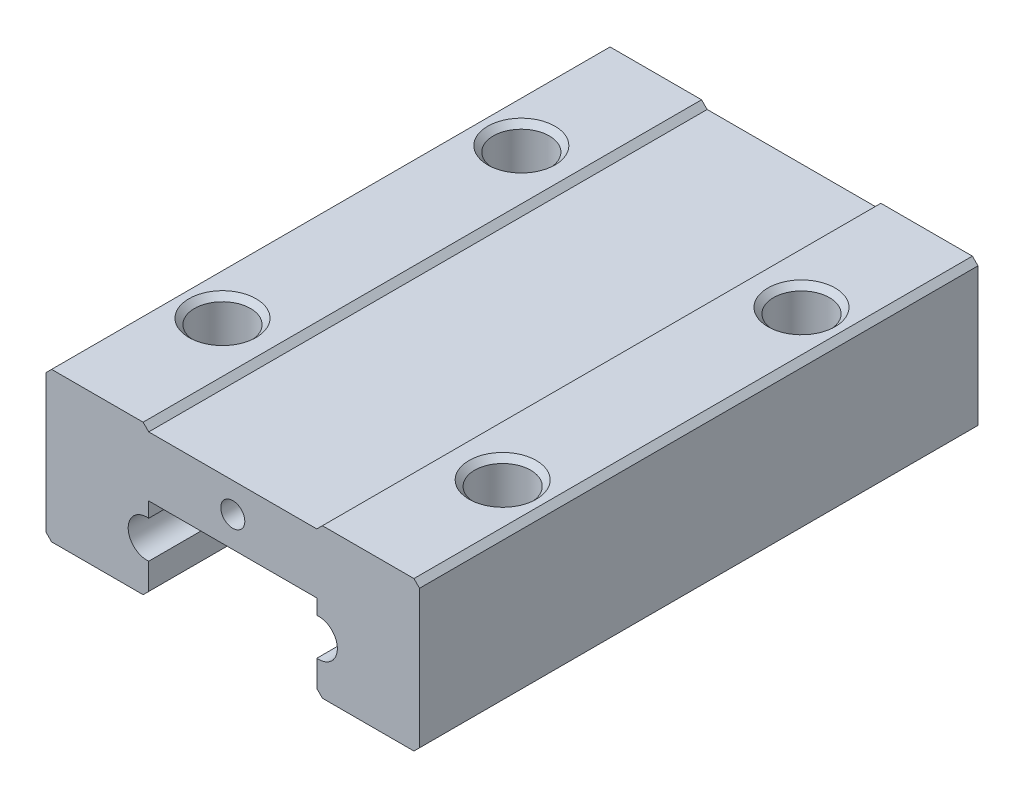
ISO-10303-21;
HEADER;
FILE_DESCRIPTION(('STEP AP214'),'2;1');
FILE_NAME('part.step','',(''),(''),'','','');
FILE_SCHEMA(('AUTOMOTIVE_DESIGN { 1 0 10303 214 1 1 1 1 }'));
ENDSEC;
DATA;
#1=APPLICATION_CONTEXT('core data for automotive mechanical design processes');
#2=APPLICATION_PROTOCOL_DEFINITION('international standard','automotive_design',2000,#1);
#3=PRODUCT_CONTEXT('',#1,'mechanical');
#4=PRODUCT('Part','Part','',(#3));
#5=PRODUCT_RELATED_PRODUCT_CATEGORY('part','',(#4));
#6=PRODUCT_DEFINITION_FORMATION('','',#4);
#7=PRODUCT_DEFINITION_CONTEXT('part definition',#1,'design');
#8=PRODUCT_DEFINITION('design','',#6,#7);
#9=PRODUCT_DEFINITION_SHAPE('','',#8);
#10=(LENGTH_UNIT() NAMED_UNIT(*) SI_UNIT(.MILLI.,.METRE.));
#11=(NAMED_UNIT(*) PLANE_ANGLE_UNIT() SI_UNIT($,.RADIAN.));
#12=(NAMED_UNIT(*) SI_UNIT($,.STERADIAN.) SOLID_ANGLE_UNIT());
#13=UNCERTAINTY_MEASURE_WITH_UNIT(LENGTH_MEASURE(1.E-05),#10,'distance_accuracy_value','');
#14=(GEOMETRIC_REPRESENTATION_CONTEXT(3) GLOBAL_UNCERTAINTY_ASSIGNED_CONTEXT((#13)) GLOBAL_UNIT_ASSIGNED_CONTEXT((#10,
#11,#12)) REPRESENTATION_CONTEXT('',''));
#15=CARTESIAN_POINT('',(0.,0.,0.));
#16=DIRECTION('',(0.,0.,1.));
#17=DIRECTION('',(1.,0.,0.));
#18=AXIS2_PLACEMENT_3D('',#15,#16,#17);
#19=CARTESIAN_POINT('',(0.,0.,-14.95));
#20=DIRECTION('',(0.,0.,-1.));
#21=DIRECTION('',(0.,-1.,0.));
#22=AXIS2_PLACEMENT_3D('',#19,#20,#21);
#23=PLANE('',#22);
#24=CARTESIAN_POINT('',(0.,2.12300290726788,-14.95));
#25=DIRECTION('',(0.,0.,1.));
#26=DIRECTION('',(1.,0.,0.));
#27=AXIS2_PLACEMENT_3D('',#24,#25,#26);
#28=CIRCLE('',#27,0.644009461630724);
#29=CARTESIAN_POINT('',(0.644009461630724,2.12300290726788,-14.95));
#30=VERTEX_POINT('',#29);
#31=EDGE_CURVE('E458',#30,#30,#28,.T.);
#32=ORIENTED_EDGE('',*,*,#31,.T.);
#33=EDGE_LOOP('',(#32));
#34=FACE_BOUND('',#33,.T.);
#35=DIRECTION('',(1.,0.,0.));
#36=VECTOR('',#35,1.);
#37=CARTESIAN_POINT('',(4.8,4.,-14.95));
#38=LINE('',#37,#36);
#39=CARTESIAN_POINT('',(4.8,4.,-14.95));
#40=VERTEX_POINT('',#39);
#41=CARTESIAN_POINT('',(9.7,4.,-14.95));
#42=VERTEX_POINT('',#41);
#43=EDGE_CURVE('E179',#40,#42,#38,.T.);
#44=ORIENTED_EDGE('',*,*,#43,.T.);
#45=DIRECTION('',(-0.707106781186546,0.707106781186549,0.));
#46=VECTOR('',#45,1.);
#47=CARTESIAN_POINT('',(10.,3.7,-14.95));
#48=LINE('',#47,#46);
#49=CARTESIAN_POINT('',(10.,3.7,-14.95));
#50=VERTEX_POINT('',#49);
#51=EDGE_CURVE('E472',#50,#42,#48,.T.);
#52=ORIENTED_EDGE('',*,*,#51,.F.);
#53=DIRECTION('',(0.,1.,0.));
#54=VECTOR('',#53,1.);
#55=CARTESIAN_POINT('',(10.,-3.7,-14.95));
#56=LINE('',#55,#54);
#57=CARTESIAN_POINT('',(10.,-3.7,-14.95));
#58=VERTEX_POINT('',#57);
#59=EDGE_CURVE('E384',#58,#50,#56,.T.);
#60=ORIENTED_EDGE('',*,*,#59,.F.);
#61=DIRECTION('',(0.707106781186546,0.707106781186549,0.));
#62=VECTOR('',#61,1.);
#63=CARTESIAN_POINT('',(9.7,-4.,-14.95));
#64=LINE('',#63,#62);
#65=CARTESIAN_POINT('',(9.7,-4.,-14.95));
#66=VERTEX_POINT('',#65);
#67=EDGE_CURVE('E515',#66,#58,#64,.T.);
#68=ORIENTED_EDGE('',*,*,#67,.F.);
#69=DIRECTION('',(1.,0.,0.));
#70=VECTOR('',#69,1.);
#71=CARTESIAN_POINT('',(4.8,-4.,-14.95));
#72=LINE('',#71,#70);
#73=CARTESIAN_POINT('',(4.8,-4.,-14.95));
#74=VERTEX_POINT('',#73);
#75=EDGE_CURVE('E361',#74,#66,#72,.T.);
#76=ORIENTED_EDGE('',*,*,#75,.F.);
#77=DIRECTION('',(0.707106781186547,-0.707106781186548,0.));
#78=VECTOR('',#77,1.);
#79=CARTESIAN_POINT('',(4.5,-3.7,-14.95));
#80=LINE('',#79,#78);
#81=CARTESIAN_POINT('',(4.5,-3.7,-14.95));
#82=VERTEX_POINT('',#81);
#83=EDGE_CURVE('E330',#82,#74,#80,.T.);
#84=ORIENTED_EDGE('',*,*,#83,.F.);
#85=DIRECTION('',(0.,1.,0.));
#86=VECTOR('',#85,1.);
#87=CARTESIAN_POINT('',(4.5,-3.7,-14.95));
#88=LINE('',#87,#86);
#89=CARTESIAN_POINT('',(4.5,-2.29498743710662,-14.95));
#90=VERTEX_POINT('',#89);
#91=EDGE_CURVE('E321',#82,#90,#88,.T.);
#92=ORIENTED_EDGE('',*,*,#91,.T.);
#93=CARTESIAN_POINT('',(4.6,-1.3,-14.95));
#94=DIRECTION('',(0.,0.,-1.));
#95=DIRECTION('',(1.,0.,0.));
#96=AXIS2_PLACEMENT_3D('',#93,#94,#95);
#97=CIRCLE('',#96,1.);
#98=CARTESIAN_POINT('',(4.5,-0.305012562893379,-14.95));
#99=VERTEX_POINT('',#98);
#100=EDGE_CURVE('E566',#99,#90,#97,.T.);
#101=ORIENTED_EDGE('',*,*,#100,.F.);
#102=DIRECTION('',(0.,1.,0.));
#103=VECTOR('',#102,1.);
#104=CARTESIAN_POINT('',(4.5,-0.305012562893379,-14.95));
#105=LINE('',#104,#103);
#106=CARTESIAN_POINT('',(4.5,0.5,-14.95));
#107=VERTEX_POINT('',#106);
#108=EDGE_CURVE('E28',#99,#107,#105,.T.);
#109=ORIENTED_EDGE('',*,*,#108,.T.);
#110=DIRECTION('',(1.,0.,0.));
#111=VECTOR('',#110,1.);
#112=CARTESIAN_POINT('',(-4.5,0.5,-14.95));
#113=LINE('',#112,#111);
#114=CARTESIAN_POINT('',(-4.5,0.5,-14.95));
#115=VERTEX_POINT('',#114);
#116=EDGE_CURVE('E354',#115,#107,#113,.T.);
#117=ORIENTED_EDGE('',*,*,#116,.F.);
#118=DIRECTION('',(0.,1.,0.));
#119=VECTOR('',#118,1.);
#120=CARTESIAN_POINT('',(-4.5,-0.30501256289338,-14.95));
#121=LINE('',#120,#119);
#122=CARTESIAN_POINT('',(-4.5,-0.30501256289338,-14.95));
#123=VERTEX_POINT('',#122);
#124=EDGE_CURVE('E448',#123,#115,#121,.T.);
#125=ORIENTED_EDGE('',*,*,#124,.F.);
#126=CARTESIAN_POINT('',(-4.6,-1.3,-14.95));
#127=DIRECTION('',(0.,0.,1.));
#128=DIRECTION('',(1.,0.,0.));
#129=AXIS2_PLACEMENT_3D('',#126,#127,#128);
#130=CIRCLE('',#129,1.);
#131=CARTESIAN_POINT('',(-4.5,-2.29498743710662,-14.95));
#132=VERTEX_POINT('',#131);
#133=EDGE_CURVE('E538',#123,#132,#130,.T.);
#134=ORIENTED_EDGE('',*,*,#133,.T.);
#135=DIRECTION('',(0.,1.,0.));
#136=VECTOR('',#135,1.);
#137=CARTESIAN_POINT('',(-4.5,-3.7,-14.95));
#138=LINE('',#137,#136);
#139=CARTESIAN_POINT('',(-4.5,-3.7,-14.95));
#140=VERTEX_POINT('',#139);
#141=EDGE_CURVE('E358',#140,#132,#138,.T.);
#142=ORIENTED_EDGE('',*,*,#141,.F.);
#143=DIRECTION('',(0.707106781186547,0.707106781186548,0.));
#144=VECTOR('',#143,1.);
#145=CARTESIAN_POINT('',(-4.8,-4.,-14.95));
#146=LINE('',#145,#144);
#147=CARTESIAN_POINT('',(-4.8,-4.,-14.95));
#148=VERTEX_POINT('',#147);
#149=EDGE_CURVE('E344',#148,#140,#146,.T.);
#150=ORIENTED_EDGE('',*,*,#149,.F.);
#151=DIRECTION('',(1.,0.,0.));
#152=VECTOR('',#151,1.);
#153=CARTESIAN_POINT('',(-9.7,-4.,-14.95));
#154=LINE('',#153,#152);
#155=CARTESIAN_POINT('',(-9.7,-4.,-14.95));
#156=VERTEX_POINT('',#155);
#157=EDGE_CURVE('E355',#156,#148,#154,.T.);
#158=ORIENTED_EDGE('',*,*,#157,.F.);
#159=DIRECTION('',(0.707106781186543,-0.707106781186552,0.));
#160=VECTOR('',#159,1.);
#161=CARTESIAN_POINT('',(-10.,-3.7,-14.95));
#162=LINE('',#161,#160);
#163=CARTESIAN_POINT('',(-10.,-3.7,-14.95));
#164=VERTEX_POINT('',#163);
#165=EDGE_CURVE('E402',#164,#156,#162,.T.);
#166=ORIENTED_EDGE('',*,*,#165,.F.);
#167=DIRECTION('',(0.,1.,0.));
#168=VECTOR('',#167,1.);
#169=CARTESIAN_POINT('',(-10.,-3.7,-14.95));
#170=LINE('',#169,#168);
#171=CARTESIAN_POINT('',(-10.,3.7,-14.95));
#172=VERTEX_POINT('',#171);
#173=EDGE_CURVE('E235',#164,#172,#170,.T.);
#174=ORIENTED_EDGE('',*,*,#173,.T.);
#175=DIRECTION('',(-0.707106781186544,-0.707106781186551,0.));
#176=VECTOR('',#175,1.);
#177=CARTESIAN_POINT('',(-9.7,4.,-14.95));
#178=LINE('',#177,#176);
#179=CARTESIAN_POINT('',(-9.7,4.,-14.95));
#180=VERTEX_POINT('',#179);
#181=EDGE_CURVE('E546',#180,#172,#178,.T.);
#182=ORIENTED_EDGE('',*,*,#181,.F.);
#183=DIRECTION('',(1.,0.,0.));
#184=VECTOR('',#183,1.);
#185=CARTESIAN_POINT('',(-9.7,4.,-14.95));
#186=LINE('',#185,#184);
#187=CARTESIAN_POINT('',(-4.8,4.,-14.95));
#188=VERTEX_POINT('',#187);
#189=EDGE_CURVE('E444',#180,#188,#186,.T.);
#190=ORIENTED_EDGE('',*,*,#189,.T.);
#191=DIRECTION('',(-0.707106781186547,0.707106781186548,0.));
#192=VECTOR('',#191,1.);
#193=CARTESIAN_POINT('',(-4.5,3.7,-14.95));
#194=LINE('',#193,#192);
#195=CARTESIAN_POINT('',(-4.5,3.7,-14.95));
#196=VERTEX_POINT('',#195);
#197=EDGE_CURVE('E377',#196,#188,#194,.T.);
#198=ORIENTED_EDGE('',*,*,#197,.F.);
#199=DIRECTION('',(1.,0.,0.));
#200=VECTOR('',#199,1.);
#201=CARTESIAN_POINT('',(-4.5,3.7,-14.95));
#202=LINE('',#201,#200);
#203=CARTESIAN_POINT('',(4.5,3.7,-14.95));
#204=VERTEX_POINT('',#203);
#205=EDGE_CURVE('E189',#196,#204,#202,.T.);
#206=ORIENTED_EDGE('',*,*,#205,.T.);
#207=DIRECTION('',(-0.707106781186547,-0.707106781186548,0.));
#208=VECTOR('',#207,1.);
#209=CARTESIAN_POINT('',(4.8,4.,-14.95));
#210=LINE('',#209,#208);
#211=EDGE_CURVE('E420',#40,#204,#210,.T.);
#212=ORIENTED_EDGE('',*,*,#211,.F.);
#213=EDGE_LOOP('',(#44,#52,#60,#68,#76,#84,#92,#101,#109,#117,#125,#134,#142,#150,#158,#166,
#174,#182,#190,#198,#206,#212));
#214=FACE_BOUND('',#213,.T.);
#215=ADVANCED_FACE('F17',(#34,#214),#23,.T.);
#216=CARTESIAN_POINT('',(-7.5,1.,-8.));
#217=DIRECTION('',(0.,1.,0.));
#218=DIRECTION('',(1.,0.,0.));
#219=AXIS2_PLACEMENT_3D('',#216,#217,#218);
#220=PLANE('',#219);
#221=CARTESIAN_POINT('',(-7.5,1.,-8.));
#222=DIRECTION('',(0.,-1.,0.));
#223=DIRECTION('',(0.,0.,-1.));
#224=AXIS2_PLACEMENT_3D('',#221,#222,#223);
#225=CIRCLE('',#224,1.5);
#226=CARTESIAN_POINT('',(-7.5,1.,-6.5));
#227=VERTEX_POINT('',#226);
#228=EDGE_CURVE('E480',#227,#227,#225,.T.);
#229=ORIENTED_EDGE('',*,*,#228,.F.);
#230=EDGE_LOOP('',(#229));
#231=FACE_BOUND('',#230,.T.);
#232=ADVANCED_FACE('F986',(#231),#220,.T.);
#233=CARTESIAN_POINT('',(7.5,1.,-8.));
#234=DIRECTION('',(0.,-1.,0.));
#235=DIRECTION('',(0.,0.,-1.));
#236=AXIS2_PLACEMENT_3D('',#233,#234,#235);
#237=PLANE('',#236);
#238=CARTESIAN_POINT('',(7.5,1.,-8.));
#239=DIRECTION('',(0.,-1.,0.));
#240=DIRECTION('',(0.,0.,1.));
#241=AXIS2_PLACEMENT_3D('',#238,#239,#240);
#242=CIRCLE('',#241,1.5);
#243=CARTESIAN_POINT('',(7.5,1.,-6.5));
#244=VERTEX_POINT('',#243);
#245=EDGE_CURVE('E525',#244,#244,#242,.T.);
#246=ORIENTED_EDGE('',*,*,#245,.F.);
#247=EDGE_LOOP('',(#246));
#248=FACE_BOUND('',#247,.T.);
#249=ADVANCED_FACE('F1026',(#248),#237,.F.);
#250=CARTESIAN_POINT('',(0.,0.,14.95));
#251=DIRECTION('',(0.,0.,1.));
#252=DIRECTION('',(1.,0.,0.));
#253=AXIS2_PLACEMENT_3D('',#250,#251,#252);
#254=PLANE('',#253);
#255=CARTESIAN_POINT('',(0.,2.12300290726788,14.95));
#256=DIRECTION('',(0.,0.,1.));
#257=DIRECTION('',(1.,0.,0.));
#258=AXIS2_PLACEMENT_3D('',#255,#256,#257);
#259=CIRCLE('',#258,0.644009461630724);
#260=CARTESIAN_POINT('',(0.644009461630724,2.12300290726788,14.95));
#261=VERTEX_POINT('',#260);
#262=EDGE_CURVE('E362',#261,#261,#259,.T.);
#263=ORIENTED_EDGE('',*,*,#262,.F.);
#264=EDGE_LOOP('',(#263));
#265=FACE_BOUND('',#264,.T.);
#266=DIRECTION('',(1.,0.,0.));
#267=VECTOR('',#266,1.);
#268=CARTESIAN_POINT('',(4.8,4.,14.95));
#269=LINE('',#268,#267);
#270=CARTESIAN_POINT('',(4.8,4.,14.95));
#271=VERTEX_POINT('',#270);
#272=CARTESIAN_POINT('',(9.7,4.,14.95));
#273=VERTEX_POINT('',#272);
#274=EDGE_CURVE('E59',#271,#273,#269,.T.);
#275=ORIENTED_EDGE('',*,*,#274,.F.);
#276=DIRECTION('',(-0.707106781186547,-0.707106781186548,0.));
#277=VECTOR('',#276,1.);
#278=CARTESIAN_POINT('',(4.8,4.,14.95));
#279=LINE('',#278,#277);
#280=CARTESIAN_POINT('',(4.5,3.7,14.95));
#281=VERTEX_POINT('',#280);
#282=EDGE_CURVE('E412',#271,#281,#279,.T.);
#283=ORIENTED_EDGE('',*,*,#282,.T.);
#284=DIRECTION('',(1.,0.,0.));
#285=VECTOR('',#284,1.);
#286=CARTESIAN_POINT('',(-4.5,3.7,14.95));
#287=LINE('',#286,#285);
#288=CARTESIAN_POINT('',(-4.5,3.7,14.95));
#289=VERTEX_POINT('',#288);
#290=EDGE_CURVE('E510',#289,#281,#287,.T.);
#291=ORIENTED_EDGE('',*,*,#290,.F.);
#292=DIRECTION('',(-0.707106781186547,0.707106781186548,0.));
#293=VECTOR('',#292,1.);
#294=CARTESIAN_POINT('',(-4.5,3.7,14.95));
#295=LINE('',#294,#293);
#296=CARTESIAN_POINT('',(-4.8,4.,14.95));
#297=VERTEX_POINT('',#296);
#298=EDGE_CURVE('E378',#289,#297,#295,.T.);
#299=ORIENTED_EDGE('',*,*,#298,.T.);
#300=DIRECTION('',(1.,0.,0.));
#301=VECTOR('',#300,1.);
#302=CARTESIAN_POINT('',(-9.7,4.,14.95));
#303=LINE('',#302,#301);
#304=CARTESIAN_POINT('',(-9.7,4.,14.95));
#305=VERTEX_POINT('',#304);
#306=EDGE_CURVE('E440',#305,#297,#303,.T.);
#307=ORIENTED_EDGE('',*,*,#306,.F.);
#308=DIRECTION('',(-0.707106781186544,-0.707106781186551,0.));
#309=VECTOR('',#308,1.);
#310=CARTESIAN_POINT('',(-9.7,4.,14.95));
#311=LINE('',#310,#309);
#312=CARTESIAN_POINT('',(-10.,3.7,14.95));
#313=VERTEX_POINT('',#312);
#314=EDGE_CURVE('E519',#305,#313,#311,.T.);
#315=ORIENTED_EDGE('',*,*,#314,.T.);
#316=DIRECTION('',(0.,1.,0.));
#317=VECTOR('',#316,1.);
#318=CARTESIAN_POINT('',(-10.,-3.7,14.95));
#319=LINE('',#318,#317);
#320=CARTESIAN_POINT('',(-10.,-3.7,14.95));
#321=VERTEX_POINT('',#320);
#322=EDGE_CURVE('E260',#321,#313,#319,.T.);
#323=ORIENTED_EDGE('',*,*,#322,.F.);
#324=DIRECTION('',(0.707106781186543,-0.707106781186552,0.));
#325=VECTOR('',#324,1.);
#326=CARTESIAN_POINT('',(-10.,-3.7,14.95));
#327=LINE('',#326,#325);
#328=CARTESIAN_POINT('',(-9.7,-4.,14.95));
#329=VERTEX_POINT('',#328);
#330=EDGE_CURVE('E403',#321,#329,#327,.T.);
#331=ORIENTED_EDGE('',*,*,#330,.T.);
#332=DIRECTION('',(1.,0.,0.));
#333=VECTOR('',#332,1.);
#334=CARTESIAN_POINT('',(-9.7,-4.,14.95));
#335=LINE('',#334,#333);
#336=CARTESIAN_POINT('',(-4.8,-4.,14.95));
#337=VERTEX_POINT('',#336);
#338=EDGE_CURVE('E248',#329,#337,#335,.T.);
#339=ORIENTED_EDGE('',*,*,#338,.T.);
#340=DIRECTION('',(0.707106781186547,0.707106781186548,0.));
#341=VECTOR('',#340,1.);
#342=CARTESIAN_POINT('',(-4.8,-4.,14.95));
#343=LINE('',#342,#341);
#344=CARTESIAN_POINT('',(-4.5,-3.7,14.95));
#345=VERTEX_POINT('',#344);
#346=EDGE_CURVE('E545',#337,#345,#343,.T.);
#347=ORIENTED_EDGE('',*,*,#346,.T.);
#348=DIRECTION('',(0.,1.,0.));
#349=VECTOR('',#348,1.);
#350=CARTESIAN_POINT('',(-4.5,-3.7,14.95));
#351=LINE('',#350,#349);
#352=CARTESIAN_POINT('',(-4.5,-2.29498743710662,14.95));
#353=VERTEX_POINT('',#352);
#354=EDGE_CURVE('E436',#345,#353,#351,.T.);
#355=ORIENTED_EDGE('',*,*,#354,.T.);
#356=CARTESIAN_POINT('',(-4.6,-1.3,14.95));
#357=DIRECTION('',(0.,0.,1.));
#358=DIRECTION('',(1.,0.,0.));
#359=AXIS2_PLACEMENT_3D('',#356,#357,#358);
#360=CIRCLE('',#359,1.);
#361=CARTESIAN_POINT('',(-4.5,-0.30501256289338,14.95));
#362=VERTEX_POINT('',#361);
#363=EDGE_CURVE('E454',#362,#353,#360,.T.);
#364=ORIENTED_EDGE('',*,*,#363,.F.);
#365=DIRECTION('',(0.,1.,0.));
#366=VECTOR('',#365,1.);
#367=CARTESIAN_POINT('',(-4.5,-0.30501256289338,14.95));
#368=LINE('',#367,#366);
#369=CARTESIAN_POINT('',(-4.5,0.5,14.95));
#370=VERTEX_POINT('',#369);
#371=EDGE_CURVE('E439',#362,#370,#368,.T.);
#372=ORIENTED_EDGE('',*,*,#371,.T.);
#373=DIRECTION('',(1.,0.,0.));
#374=VECTOR('',#373,1.);
#375=CARTESIAN_POINT('',(-4.5,0.5,14.95));
#376=LINE('',#375,#374);
#377=CARTESIAN_POINT('',(4.5,0.5,14.95));
#378=VERTEX_POINT('',#377);
#379=EDGE_CURVE('E445',#370,#378,#376,.T.);
#380=ORIENTED_EDGE('',*,*,#379,.T.);
#381=DIRECTION('',(0.,1.,0.));
#382=VECTOR('',#381,1.);
#383=CARTESIAN_POINT('',(4.5,-0.305012562893379,14.95));
#384=LINE('',#383,#382);
#385=CARTESIAN_POINT('',(4.5,-0.305012562893379,14.95));
#386=VERTEX_POINT('',#385);
#387=EDGE_CURVE('E11',#386,#378,#384,.T.);
#388=ORIENTED_EDGE('',*,*,#387,.F.);
#389=CARTESIAN_POINT('',(4.6,-1.3,14.95));
#390=DIRECTION('',(0.,0.,-1.));
#391=DIRECTION('',(1.,0.,0.));
#392=AXIS2_PLACEMENT_3D('',#389,#390,#391);
#393=CIRCLE('',#392,1.);
#394=CARTESIAN_POINT('',(4.5,-2.29498743710662,14.95));
#395=VERTEX_POINT('',#394);
#396=EDGE_CURVE('E316',#386,#395,#393,.T.);
#397=ORIENTED_EDGE('',*,*,#396,.T.);
#398=DIRECTION('',(0.,1.,0.));
#399=VECTOR('',#398,1.);
#400=CARTESIAN_POINT('',(4.5,-3.7,14.95));
#401=LINE('',#400,#399);
#402=CARTESIAN_POINT('',(4.5,-3.7,14.95));
#403=VERTEX_POINT('',#402);
#404=EDGE_CURVE('E311',#403,#395,#401,.T.);
#405=ORIENTED_EDGE('',*,*,#404,.F.);
#406=DIRECTION('',(0.707106781186547,-0.707106781186548,0.));
#407=VECTOR('',#406,1.);
#408=CARTESIAN_POINT('',(4.5,-3.7,14.95));
#409=LINE('',#408,#407);
#410=CARTESIAN_POINT('',(4.8,-4.,14.95));
#411=VERTEX_POINT('',#410);
#412=EDGE_CURVE('E314',#403,#411,#409,.T.);
#413=ORIENTED_EDGE('',*,*,#412,.T.);
#414=DIRECTION('',(1.,0.,0.));
#415=VECTOR('',#414,1.);
#416=CARTESIAN_POINT('',(4.8,-4.,14.95));
#417=LINE('',#416,#415);
#418=CARTESIAN_POINT('',(9.7,-4.,14.95));
#419=VERTEX_POINT('',#418);
#420=EDGE_CURVE('E498',#411,#419,#417,.T.);
#421=ORIENTED_EDGE('',*,*,#420,.T.);
#422=DIRECTION('',(0.707106781186546,0.707106781186549,0.));
#423=VECTOR('',#422,1.);
#424=CARTESIAN_POINT('',(9.7,-4.,14.95));
#425=LINE('',#424,#423);
#426=CARTESIAN_POINT('',(10.,-3.7,14.95));
#427=VERTEX_POINT('',#426);
#428=EDGE_CURVE('E394',#419,#427,#425,.T.);
#429=ORIENTED_EDGE('',*,*,#428,.T.);
#430=DIRECTION('',(0.,1.,0.));
#431=VECTOR('',#430,1.);
#432=CARTESIAN_POINT('',(10.,-3.7,14.95));
#433=LINE('',#432,#431);
#434=CARTESIAN_POINT('',(10.,3.7,14.95));
#435=VERTEX_POINT('',#434);
#436=EDGE_CURVE('E76',#427,#435,#433,.T.);
#437=ORIENTED_EDGE('',*,*,#436,.T.);
#438=DIRECTION('',(-0.707106781186546,0.707106781186549,0.));
#439=VECTOR('',#438,1.);
#440=CARTESIAN_POINT('',(10.,3.7,14.95));
#441=LINE('',#440,#439);
#442=EDGE_CURVE('E428',#435,#273,#441,.T.);
#443=ORIENTED_EDGE('',*,*,#442,.T.);
#444=EDGE_LOOP('',(#275,#283,#291,#299,#307,#315,#323,#331,#339,#347,#355,#364,#372,#380,#388,
#397,#405,#413,#421,#429,#437,#443));
#445=FACE_BOUND('',#444,.T.);
#446=ADVANCED_FACE('F19',(#265,#445),#254,.T.);
#447=CARTESIAN_POINT('',(4.5,0.,14.95));
#448=DIRECTION('',(-1.,0.,0.));
#449=DIRECTION('',(0.,1.,0.));
#450=AXIS2_PLACEMENT_3D('',#447,#448,#449);
#451=PLANE('',#450);
#452=DIRECTION('',(0.,0.,-1.));
#453=VECTOR('',#452,1.);
#454=CARTESIAN_POINT('',(4.5,0.5,14.95));
#455=LINE('',#454,#453);
#456=EDGE_CURVE('E449',#378,#107,#455,.T.);
#457=ORIENTED_EDGE('',*,*,#456,.T.);
#458=ORIENTED_EDGE('',*,*,#108,.F.);
#459=DIRECTION('',(0.,0.,-1.));
#460=VECTOR('',#459,1.);
#461=CARTESIAN_POINT('',(4.5,-0.305012562893379,14.95));
#462=LINE('',#461,#460);
#463=EDGE_CURVE('E501',#386,#99,#462,.T.);
#464=ORIENTED_EDGE('',*,*,#463,.F.);
#465=ORIENTED_EDGE('',*,*,#387,.T.);
#466=EDGE_LOOP('',(#457,#458,#464,#465));
#467=FACE_BOUND('',#466,.T.);
#468=ADVANCED_FACE('F598',(#467),#451,.T.);
#469=CARTESIAN_POINT('',(4.5,0.,14.95));
#470=DIRECTION('',(-1.,0.,0.));
#471=DIRECTION('',(0.,0.,1.));
#472=AXIS2_PLACEMENT_3D('',#469,#470,#471);
#473=PLANE('',#472);
#474=DIRECTION('',(0.,0.,-1.));
#475=VECTOR('',#474,1.);
#476=CARTESIAN_POINT('',(4.5,-2.29498743710662,14.95));
#477=LINE('',#476,#475);
#478=EDGE_CURVE('E533',#395,#90,#477,.T.);
#479=ORIENTED_EDGE('',*,*,#478,.T.);
#480=ORIENTED_EDGE('',*,*,#91,.F.);
#481=DIRECTION('',(0.,0.,1.));
#482=VECTOR('',#481,1.);
#483=CARTESIAN_POINT('',(4.5,-3.7,-14.95));
#484=LINE('',#483,#482);
#485=EDGE_CURVE('E324',#82,#403,#484,.T.);
#486=ORIENTED_EDGE('',*,*,#485,.T.);
#487=ORIENTED_EDGE('',*,*,#404,.T.);
#488=EDGE_LOOP('',(#479,#480,#486,#487));
#489=FACE_BOUND('',#488,.T.);
#490=ADVANCED_FACE('F325',(#489),#473,.T.);
#491=CARTESIAN_POINT('',(0.,-4.,14.95));
#492=DIRECTION('',(0.,1.,0.));
#493=DIRECTION('',(1.,0.,0.));
#494=AXIS2_PLACEMENT_3D('',#491,#492,#493);
#495=PLANE('',#494);
#496=ORIENTED_EDGE('',*,*,#420,.F.);
#497=DIRECTION('',(0.,0.,-1.));
#498=VECTOR('',#497,1.);
#499=CARTESIAN_POINT('',(4.8,-4.,14.95));
#500=LINE('',#499,#498);
#501=EDGE_CURVE('E335',#411,#74,#500,.T.);
#502=ORIENTED_EDGE('',*,*,#501,.T.);
#503=ORIENTED_EDGE('',*,*,#75,.T.);
#504=DIRECTION('',(0.,0.,1.));
#505=VECTOR('',#504,1.);
#506=CARTESIAN_POINT('',(9.7,-4.,-14.95));
#507=LINE('',#506,#505);
#508=EDGE_CURVE('E397',#66,#419,#507,.T.);
#509=ORIENTED_EDGE('',*,*,#508,.T.);
#510=EDGE_LOOP('',(#496,#502,#503,#509));
#511=FACE_BOUND('',#510,.T.);
#512=ADVANCED_FACE('F949',(#511),#495,.F.);
#513=CARTESIAN_POINT('',(10.,0.,14.95));
#514=DIRECTION('',(-1.,0.,0.));
#515=DIRECTION('',(0.,0.,1.));
#516=AXIS2_PLACEMENT_3D('',#513,#514,#515);
#517=PLANE('',#516);
#518=ORIENTED_EDGE('',*,*,#436,.F.);
#519=DIRECTION('',(0.,0.,-1.));
#520=VECTOR('',#519,1.);
#521=CARTESIAN_POINT('',(10.,-3.7,14.95));
#522=LINE('',#521,#520);
#523=EDGE_CURVE('E511',#427,#58,#522,.T.);
#524=ORIENTED_EDGE('',*,*,#523,.T.);
#525=ORIENTED_EDGE('',*,*,#59,.T.);
#526=DIRECTION('',(0.,0.,1.));
#527=VECTOR('',#526,1.);
#528=CARTESIAN_POINT('',(10.,3.7,-14.95));
#529=LINE('',#528,#527);
#530=EDGE_CURVE('E348',#50,#435,#529,.T.);
#531=ORIENTED_EDGE('',*,*,#530,.T.);
#532=EDGE_LOOP('',(#518,#524,#525,#531));
#533=FACE_BOUND('',#532,.T.);
#534=ADVANCED_FACE('F679',(#533),#517,.F.);
#535=CARTESIAN_POINT('',(0.,4.,14.95));
#536=DIRECTION('',(0.,1.,0.));
#537=DIRECTION('',(0.,0.,-1.));
#538=AXIS2_PLACEMENT_3D('',#535,#536,#537);
#539=PLANE('',#538);
#540=CARTESIAN_POINT('',(7.5,4.,8.));
#541=DIRECTION('',(0.,-1.,0.));
#542=DIRECTION('',(-1.,0.,0.));
#543=AXIS2_PLACEMENT_3D('',#540,#541,#542);
#544=CIRCLE('',#543,1.8);
#545=CARTESIAN_POINT('',(7.5,4.,6.2));
#546=VERTEX_POINT('',#545);
#547=EDGE_CURVE('E371',#546,#546,#544,.T.);
#548=ORIENTED_EDGE('',*,*,#547,.T.);
#549=EDGE_LOOP('',(#548));
#550=FACE_BOUND('',#549,.T.);
#551=CARTESIAN_POINT('',(7.5,4.,-8.));
#552=DIRECTION('',(0.,1.,0.));
#553=DIRECTION('',(-1.,0.,0.));
#554=AXIS2_PLACEMENT_3D('',#551,#552,#553);
#555=CIRCLE('',#554,1.8);
#556=CARTESIAN_POINT('',(7.5,4.,-6.2));
#557=VERTEX_POINT('',#556);
#558=EDGE_CURVE('E478',#557,#557,#555,.T.);
#559=ORIENTED_EDGE('',*,*,#558,.F.);
#560=EDGE_LOOP('',(#559));
#561=FACE_BOUND('',#560,.T.);
#562=DIRECTION('',(0.,0.,-1.));
#563=VECTOR('',#562,1.);
#564=CARTESIAN_POINT('',(9.7,4.,14.95));
#565=LINE('',#564,#563);
#566=EDGE_CURVE('E398',#273,#42,#565,.T.);
#567=ORIENTED_EDGE('',*,*,#566,.T.);
#568=ORIENTED_EDGE('',*,*,#43,.F.);
#569=DIRECTION('',(0.,0.,1.));
#570=VECTOR('',#569,1.);
#571=CARTESIAN_POINT('',(4.8,4.,-14.95));
#572=LINE('',#571,#570);
#573=EDGE_CURVE('E416',#40,#271,#572,.T.);
#574=ORIENTED_EDGE('',*,*,#573,.T.);
#575=ORIENTED_EDGE('',*,*,#274,.T.);
#576=EDGE_LOOP('',(#567,#568,#574,#575));
#577=FACE_BOUND('',#576,.T.);
#578=ADVANCED_FACE('F668',(#550,#561,#577),#539,.T.);
#579=CARTESIAN_POINT('',(0.,3.7,14.95));
#580=DIRECTION('',(0.,1.,0.));
#581=DIRECTION('',(0.,0.,-1.));
#582=AXIS2_PLACEMENT_3D('',#579,#580,#581);
#583=PLANE('',#582);
#584=DIRECTION('',(0.,0.,-1.));
#585=VECTOR('',#584,1.);
#586=CARTESIAN_POINT('',(4.5,3.7,14.95));
#587=LINE('',#586,#585);
#588=EDGE_CURVE('E424',#281,#204,#587,.T.);
#589=ORIENTED_EDGE('',*,*,#588,.T.);
#590=ORIENTED_EDGE('',*,*,#205,.F.);
#591=DIRECTION('',(0.,0.,-1.));
#592=VECTOR('',#591,1.);
#593=CARTESIAN_POINT('',(-4.5,3.7,14.95));
#594=LINE('',#593,#592);
#595=EDGE_CURVE('E373',#289,#196,#594,.T.);
#596=ORIENTED_EDGE('',*,*,#595,.F.);
#597=ORIENTED_EDGE('',*,*,#290,.T.);
#598=EDGE_LOOP('',(#589,#590,#596,#597));
#599=FACE_BOUND('',#598,.T.);
#600=ADVANCED_FACE('F659',(#599),#583,.T.);
#601=CARTESIAN_POINT('',(0.,4.,14.95));
#602=DIRECTION('',(0.,1.,0.));
#603=DIRECTION('',(1.,0.,0.));
#604=AXIS2_PLACEMENT_3D('',#601,#602,#603);
#605=PLANE('',#604);
#606=CARTESIAN_POINT('',(-7.5,4.,8.));
#607=DIRECTION('',(0.,-1.,0.));
#608=DIRECTION('',(0.,0.,1.));
#609=AXIS2_PLACEMENT_3D('',#606,#607,#608);
#610=CIRCLE('',#609,1.8);
#611=CARTESIAN_POINT('',(-7.5,4.,6.2));
#612=VERTEX_POINT('',#611);
#613=EDGE_CURVE('E390',#612,#612,#610,.T.);
#614=ORIENTED_EDGE('',*,*,#613,.T.);
#615=EDGE_LOOP('',(#614));
#616=FACE_BOUND('',#615,.T.);
#617=CARTESIAN_POINT('',(-7.5,4.,-8.));
#618=DIRECTION('',(0.,1.,0.));
#619=DIRECTION('',(0.,0.,-1.));
#620=AXIS2_PLACEMENT_3D('',#617,#618,#619);
#621=CIRCLE('',#620,1.8);
#622=CARTESIAN_POINT('',(-7.5,4.,-6.2));
#623=VERTEX_POINT('',#622);
#624=EDGE_CURVE('E151',#623,#623,#621,.T.);
#625=ORIENTED_EDGE('',*,*,#624,.F.);
#626=EDGE_LOOP('',(#625));
#627=FACE_BOUND('',#626,.T.);
#628=ORIENTED_EDGE('',*,*,#306,.T.);
#629=DIRECTION('',(0.,0.,-1.));
#630=VECTOR('',#629,1.);
#631=CARTESIAN_POINT('',(-4.8,4.,14.95));
#632=LINE('',#631,#630);
#633=EDGE_CURVE('E417',#297,#188,#632,.T.);
#634=ORIENTED_EDGE('',*,*,#633,.T.);
#635=ORIENTED_EDGE('',*,*,#189,.F.);
#636=DIRECTION('',(0.,0.,1.));
#637=VECTOR('',#636,1.);
#638=CARTESIAN_POINT('',(-9.7,4.,-14.95));
#639=LINE('',#638,#637);
#640=EDGE_CURVE('E625',#180,#305,#639,.T.);
#641=ORIENTED_EDGE('',*,*,#640,.T.);
#642=EDGE_LOOP('',(#628,#634,#635,#641));
#643=FACE_BOUND('',#642,.T.);
#644=ADVANCED_FACE('F653',(#616,#627,#643),#605,.T.);
#645=CARTESIAN_POINT('',(-10.,0.,14.95));
#646=DIRECTION('',(-1.,0.,0.));
#647=DIRECTION('',(0.,1.,0.));
#648=AXIS2_PLACEMENT_3D('',#645,#646,#647);
#649=PLANE('',#648);
#650=ORIENTED_EDGE('',*,*,#322,.T.);
#651=DIRECTION('',(0.,0.,-1.));
#652=VECTOR('',#651,1.);
#653=CARTESIAN_POINT('',(-10.,3.7,14.95));
#654=LINE('',#653,#652);
#655=EDGE_CURVE('E542',#313,#172,#654,.T.);
#656=ORIENTED_EDGE('',*,*,#655,.T.);
#657=ORIENTED_EDGE('',*,*,#173,.F.);
#658=DIRECTION('',(0.,0.,1.));
#659=VECTOR('',#658,1.);
#660=CARTESIAN_POINT('',(-10.,-3.7,-14.95));
#661=LINE('',#660,#659);
#662=EDGE_CURVE('E399',#164,#321,#661,.T.);
#663=ORIENTED_EDGE('',*,*,#662,.T.);
#664=EDGE_LOOP('',(#650,#656,#657,#663));
#665=FACE_BOUND('',#664,.T.);
#666=ADVANCED_FACE('F908',(#665),#649,.T.);
#667=CARTESIAN_POINT('',(0.,-4.,14.95));
#668=DIRECTION('',(0.,1.,0.));
#669=DIRECTION('',(1.,0.,0.));
#670=AXIS2_PLACEMENT_3D('',#667,#668,#669);
#671=PLANE('',#670);
#672=DIRECTION('',(0.,0.,-1.));
#673=VECTOR('',#672,1.);
#674=CARTESIAN_POINT('',(-9.7,-4.,14.95));
#675=LINE('',#674,#673);
#676=EDGE_CURVE('E516',#329,#156,#675,.T.);
#677=ORIENTED_EDGE('',*,*,#676,.T.);
#678=ORIENTED_EDGE('',*,*,#157,.T.);
#679=DIRECTION('',(0.,0.,1.));
#680=VECTOR('',#679,1.);
#681=CARTESIAN_POINT('',(-4.8,-4.,-14.95));
#682=LINE('',#681,#680);
#683=EDGE_CURVE('E453',#148,#337,#682,.T.);
#684=ORIENTED_EDGE('',*,*,#683,.T.);
#685=ORIENTED_EDGE('',*,*,#338,.F.);
#686=EDGE_LOOP('',(#677,#678,#684,#685));
#687=FACE_BOUND('',#686,.T.);
#688=ADVANCED_FACE('F902',(#687),#671,.F.);
#689=CARTESIAN_POINT('',(-4.5,0.,14.95));
#690=DIRECTION('',(-1.,0.,0.));
#691=DIRECTION('',(0.,0.,1.));
#692=AXIS2_PLACEMENT_3D('',#689,#690,#691);
#693=PLANE('',#692);
#694=ORIENTED_EDGE('',*,*,#354,.F.);
#695=DIRECTION('',(0.,0.,-1.));
#696=VECTOR('',#695,1.);
#697=CARTESIAN_POINT('',(-4.5,-3.7,14.95));
#698=LINE('',#697,#696);
#699=EDGE_CURVE('E337',#345,#140,#698,.T.);
#700=ORIENTED_EDGE('',*,*,#699,.T.);
#701=ORIENTED_EDGE('',*,*,#141,.T.);
#702=DIRECTION('',(0.,0.,-1.));
#703=VECTOR('',#702,1.);
#704=CARTESIAN_POINT('',(-4.5,-2.29498743710662,14.95));
#705=LINE('',#704,#703);
#706=EDGE_CURVE('E457',#353,#132,#705,.T.);
#707=ORIENTED_EDGE('',*,*,#706,.F.);
#708=EDGE_LOOP('',(#694,#700,#701,#707));
#709=FACE_BOUND('',#708,.T.);
#710=ADVANCED_FACE('F907',(#709),#693,.F.);
#711=CARTESIAN_POINT('',(-4.5,0.,14.95));
#712=DIRECTION('',(-1.,0.,0.));
#713=DIRECTION('',(0.,1.,0.));
#714=AXIS2_PLACEMENT_3D('',#711,#712,#713);
#715=PLANE('',#714);
#716=DIRECTION('',(0.,0.,-1.));
#717=VECTOR('',#716,1.);
#718=CARTESIAN_POINT('',(-4.5,-0.30501256289338,14.95));
#719=LINE('',#718,#717);
#720=EDGE_CURVE('E435',#362,#123,#719,.T.);
#721=ORIENTED_EDGE('',*,*,#720,.T.);
#722=ORIENTED_EDGE('',*,*,#124,.T.);
#723=DIRECTION('',(0.,0.,-1.));
#724=VECTOR('',#723,1.);
#725=CARTESIAN_POINT('',(-4.5,0.5,14.95));
#726=LINE('',#725,#724);
#727=EDGE_CURVE('E350',#370,#115,#726,.T.);
#728=ORIENTED_EDGE('',*,*,#727,.F.);
#729=ORIENTED_EDGE('',*,*,#371,.F.);
#730=EDGE_LOOP('',(#721,#722,#728,#729));
#731=FACE_BOUND('',#730,.T.);
#732=ADVANCED_FACE('F610',(#731),#715,.F.);
#733=CARTESIAN_POINT('',(0.,0.5,14.95));
#734=DIRECTION('',(0.,1.,0.));
#735=DIRECTION('',(1.,0.,0.));
#736=AXIS2_PLACEMENT_3D('',#733,#734,#735);
#737=PLANE('',#736);
#738=ORIENTED_EDGE('',*,*,#727,.T.);
#739=ORIENTED_EDGE('',*,*,#116,.T.);
#740=ORIENTED_EDGE('',*,*,#456,.F.);
#741=ORIENTED_EDGE('',*,*,#379,.F.);
#742=EDGE_LOOP('',(#738,#739,#740,#741));
#743=FACE_BOUND('',#742,.T.);
#744=ADVANCED_FACE('F602',(#743),#737,.F.);
#745=CARTESIAN_POINT('',(4.6,-1.3,19.951));
#746=DIRECTION('',(0.,0.,-1.));
#747=DIRECTION('',(1.,0.,0.));
#748=AXIS2_PLACEMENT_3D('',#745,#746,#747);
#749=CYLINDRICAL_SURFACE('',#748,1.);
#750=ORIENTED_EDGE('',*,*,#463,.T.);
#751=ORIENTED_EDGE('',*,*,#100,.T.);
#752=ORIENTED_EDGE('',*,*,#478,.F.);
#753=ORIENTED_EDGE('',*,*,#396,.F.);
#754=EDGE_LOOP('',(#750,#751,#752,#753));
#755=FACE_BOUND('',#754,.T.);
#756=ADVANCED_FACE('F593',(#755),#749,.F.);
#757=CARTESIAN_POINT('',(4.5,3.7,14.95));
#758=DIRECTION('',(-0.707106781186548,0.707106781186548,0.));
#759=DIRECTION('',(0.,0.,1.));
#760=AXIS2_PLACEMENT_3D('',#757,#758,#759);
#761=PLANE('',#760);
#762=ORIENTED_EDGE('',*,*,#282,.F.);
#763=ORIENTED_EDGE('',*,*,#573,.F.);
#764=ORIENTED_EDGE('',*,*,#211,.T.);
#765=ORIENTED_EDGE('',*,*,#588,.F.);
#766=EDGE_LOOP('',(#762,#763,#764,#765));
#767=FACE_BOUND('',#766,.T.);
#768=ADVANCED_FACE('F664',(#767),#761,.T.);
#769=CARTESIAN_POINT('',(-4.8,4.,14.95));
#770=DIRECTION('',(-0.707106781186548,-0.707106781186548,0.));
#771=DIRECTION('',(-0.707106781186548,0.707106781186548,0.));
#772=AXIS2_PLACEMENT_3D('',#769,#770,#771);
#773=PLANE('',#772);
#774=ORIENTED_EDGE('',*,*,#298,.F.);
#775=ORIENTED_EDGE('',*,*,#595,.T.);
#776=ORIENTED_EDGE('',*,*,#197,.T.);
#777=ORIENTED_EDGE('',*,*,#633,.F.);
#778=EDGE_LOOP('',(#774,#775,#776,#777));
#779=FACE_BOUND('',#778,.T.);
#780=ADVANCED_FACE('F656',(#779),#773,.F.);
#781=CARTESIAN_POINT('',(4.8,-4.,14.95));
#782=DIRECTION('',(-0.707106781186548,-0.707106781186548,0.));
#783=DIRECTION('',(-0.707106781186548,0.707106781186548,0.));
#784=AXIS2_PLACEMENT_3D('',#781,#782,#783);
#785=PLANE('',#784);
#786=ORIENTED_EDGE('',*,*,#412,.F.);
#787=ORIENTED_EDGE('',*,*,#485,.F.);
#788=ORIENTED_EDGE('',*,*,#83,.T.);
#789=ORIENTED_EDGE('',*,*,#501,.F.);
#790=EDGE_LOOP('',(#786,#787,#788,#789));
#791=FACE_BOUND('',#790,.T.);
#792=ADVANCED_FACE('F333',(#791),#785,.T.);
#793=CARTESIAN_POINT('',(-4.5,-3.7,14.95));
#794=DIRECTION('',(-0.707106781186548,0.707106781186548,0.));
#795=DIRECTION('',(0.,0.,1.));
#796=AXIS2_PLACEMENT_3D('',#793,#794,#795);
#797=PLANE('',#796);
#798=ORIENTED_EDGE('',*,*,#346,.F.);
#799=ORIENTED_EDGE('',*,*,#683,.F.);
#800=ORIENTED_EDGE('',*,*,#149,.T.);
#801=ORIENTED_EDGE('',*,*,#699,.F.);
#802=EDGE_LOOP('',(#798,#799,#800,#801));
#803=FACE_BOUND('',#802,.T.);
#804=ADVANCED_FACE('F819',(#803),#797,.F.);
#805=CARTESIAN_POINT('',(-10.,3.7,14.95));
#806=DIRECTION('',(0.70710678118655,-0.707106781186545,0.));
#807=DIRECTION('',(0.,0.,-1.));
#808=AXIS2_PLACEMENT_3D('',#805,#806,#807);
#809=PLANE('',#808);
#810=ORIENTED_EDGE('',*,*,#314,.F.);
#811=ORIENTED_EDGE('',*,*,#640,.F.);
#812=ORIENTED_EDGE('',*,*,#181,.T.);
#813=ORIENTED_EDGE('',*,*,#655,.F.);
#814=EDGE_LOOP('',(#810,#811,#812,#813));
#815=FACE_BOUND('',#814,.T.);
#816=ADVANCED_FACE('F686',(#815),#809,.F.);
#817=CARTESIAN_POINT('',(-9.7,-4.,14.95));
#818=DIRECTION('',(-0.707106781186552,-0.707106781186543,0.));
#819=DIRECTION('',(-0.707106781186543,0.707106781186552,0.));
#820=AXIS2_PLACEMENT_3D('',#817,#818,#819);
#821=PLANE('',#820);
#822=ORIENTED_EDGE('',*,*,#330,.F.);
#823=ORIENTED_EDGE('',*,*,#662,.F.);
#824=ORIENTED_EDGE('',*,*,#165,.T.);
#825=ORIENTED_EDGE('',*,*,#676,.F.);
#826=EDGE_LOOP('',(#822,#823,#824,#825));
#827=FACE_BOUND('',#826,.T.);
#828=ADVANCED_FACE('F863',(#827),#821,.T.);
#829=CARTESIAN_POINT('',(10.,-3.7,14.95));
#830=DIRECTION('',(-0.707106781186548,0.707106781186548,0.));
#831=DIRECTION('',(0.,0.,1.));
#832=AXIS2_PLACEMENT_3D('',#829,#830,#831);
#833=PLANE('',#832);
#834=ORIENTED_EDGE('',*,*,#428,.F.);
#835=ORIENTED_EDGE('',*,*,#508,.F.);
#836=ORIENTED_EDGE('',*,*,#67,.T.);
#837=ORIENTED_EDGE('',*,*,#523,.F.);
#838=EDGE_LOOP('',(#834,#835,#836,#837));
#839=FACE_BOUND('',#838,.T.);
#840=ADVANCED_FACE('F813',(#839),#833,.F.);
#841=CARTESIAN_POINT('',(9.7,4.,14.95));
#842=DIRECTION('',(0.70710678118655,0.707106781186545,0.));
#843=DIRECTION('',(0.,0.,-1.));
#844=AXIS2_PLACEMENT_3D('',#841,#842,#843);
#845=PLANE('',#844);
#846=ORIENTED_EDGE('',*,*,#442,.F.);
#847=ORIENTED_EDGE('',*,*,#530,.F.);
#848=ORIENTED_EDGE('',*,*,#51,.T.);
#849=ORIENTED_EDGE('',*,*,#566,.F.);
#850=EDGE_LOOP('',(#846,#847,#848,#849));
#851=FACE_BOUND('',#850,.T.);
#852=ADVANCED_FACE('F671',(#851),#845,.T.);
#853=CARTESIAN_POINT('',(-7.5,1.,8.));
#854=DIRECTION('',(0.,1.,0.));
#855=DIRECTION('',(1.,0.,0.));
#856=AXIS2_PLACEMENT_3D('',#853,#854,#855);
#857=PLANE('',#856);
#858=CARTESIAN_POINT('',(-7.5,1.,8.));
#859=DIRECTION('',(0.,1.,0.));
#860=DIRECTION('',(0.,0.,1.));
#861=AXIS2_PLACEMENT_3D('',#858,#859,#860);
#862=CIRCLE('',#861,1.5);
#863=CARTESIAN_POINT('',(-7.5,1.,6.5));
#864=VERTEX_POINT('',#863);
#865=EDGE_CURVE('E427',#864,#864,#862,.T.);
#866=ORIENTED_EDGE('',*,*,#865,.T.);
#867=EDGE_LOOP('',(#866));
#868=FACE_BOUND('',#867,.T.);
#869=ADVANCED_FACE('F812',(#868),#857,.T.);
#870=CARTESIAN_POINT('',(7.5,1.,8.));
#871=DIRECTION('',(0.,-1.,0.));
#872=DIRECTION('',(0.,0.,-1.));
#873=AXIS2_PLACEMENT_3D('',#870,#871,#872);
#874=PLANE('',#873);
#875=CARTESIAN_POINT('',(7.5,1.,8.));
#876=DIRECTION('',(0.,1.,0.));
#877=DIRECTION('',(0.,0.,-1.));
#878=AXIS2_PLACEMENT_3D('',#875,#876,#877);
#879=CIRCLE('',#878,1.5);
#880=CARTESIAN_POINT('',(7.5,1.,6.5));
#881=VERTEX_POINT('',#880);
#882=EDGE_CURVE('E406',#881,#881,#879,.T.);
#883=ORIENTED_EDGE('',*,*,#882,.T.);
#884=EDGE_LOOP('',(#883));
#885=FACE_BOUND('',#884,.T.);
#886=ADVANCED_FACE('F967',(#885),#874,.F.);
#887=CARTESIAN_POINT('',(7.5,1.,8.));
#888=DIRECTION('',(0.,1.,0.));
#889=DIRECTION('',(0.,0.,1.));
#890=AXIS2_PLACEMENT_3D('',#887,#888,#889);
#891=CYLINDRICAL_SURFACE('',#890,1.5);
#892=ORIENTED_EDGE('',*,*,#882,.F.);
#893=DIRECTION('',(0.,1.,0.));
#894=VECTOR('',#893,1.);
#895=CARTESIAN_POINT('',(7.5,1.,6.5));
#896=LINE('',#895,#894);
#897=CARTESIAN_POINT('',(7.5,3.7,6.5));
#898=VERTEX_POINT('',#897);
#899=EDGE_CURVE('E410',#881,#898,#896,.T.);
#900=ORIENTED_EDGE('',*,*,#899,.T.);
#901=CARTESIAN_POINT('',(7.5,3.7,8.));
#902=DIRECTION('',(0.,1.,0.));
#903=DIRECTION('',(0.,0.,1.));
#904=AXIS2_PLACEMENT_3D('',#901,#902,#903);
#905=CIRCLE('',#904,1.5);
#906=EDGE_CURVE('E372',#898,#898,#905,.T.);
#907=ORIENTED_EDGE('',*,*,#906,.T.);
#908=ORIENTED_EDGE('',*,*,#899,.F.);
#909=EDGE_LOOP('',(#892,#900,#907,#908));
#910=FACE_BOUND('',#909,.T.);
#911=ADVANCED_FACE('F888',(#910),#891,.F.);
#912=CARTESIAN_POINT('',(-7.5,1.,8.));
#913=DIRECTION('',(0.,1.,0.));
#914=DIRECTION('',(0.,0.,1.));
#915=AXIS2_PLACEMENT_3D('',#912,#913,#914);
#916=CYLINDRICAL_SURFACE('',#915,1.5);
#917=ORIENTED_EDGE('',*,*,#865,.F.);
#918=DIRECTION('',(0.,1.,0.));
#919=VECTOR('',#918,1.);
#920=CARTESIAN_POINT('',(-7.5,1.,6.5));
#921=LINE('',#920,#919);
#922=CARTESIAN_POINT('',(-7.5,3.7,6.5));
#923=VERTEX_POINT('',#922);
#924=EDGE_CURVE('E411',#864,#923,#921,.T.);
#925=ORIENTED_EDGE('',*,*,#924,.T.);
#926=CARTESIAN_POINT('',(-7.5,3.7,8.));
#927=DIRECTION('',(0.,1.,0.));
#928=DIRECTION('',(0.,0.,1.));
#929=AXIS2_PLACEMENT_3D('',#926,#927,#928);
#930=CIRCLE('',#929,1.5);
#931=EDGE_CURVE('E431',#923,#923,#930,.T.);
#932=ORIENTED_EDGE('',*,*,#931,.T.);
#933=ORIENTED_EDGE('',*,*,#924,.F.);
#934=EDGE_LOOP('',(#917,#925,#932,#933));
#935=FACE_BOUND('',#934,.T.);
#936=ADVANCED_FACE('F882',(#935),#916,.F.);
#937=CARTESIAN_POINT('',(7.5,3.7,8.));
#938=DIRECTION('',(0.,1.,0.));
#939=DIRECTION('',(0.,0.,1.));
#940=AXIS2_PLACEMENT_3D('',#937,#938,#939);
#941=CONICAL_SURFACE('',#940,1.5,0.785398163397449);
#942=ORIENTED_EDGE('',*,*,#906,.F.);
#943=DIRECTION('',(0.,0.707106781186547,-0.707106781186548));
#944=VECTOR('',#943,1.);
#945=CARTESIAN_POINT('',(7.5,3.7,6.5));
#946=LINE('',#945,#944);
#947=EDGE_CURVE('E367',#898,#546,#946,.T.);
#948=ORIENTED_EDGE('',*,*,#947,.T.);
#949=ORIENTED_EDGE('',*,*,#547,.F.);
#950=ORIENTED_EDGE('',*,*,#947,.F.);
#951=EDGE_LOOP('',(#942,#948,#949,#950));
#952=FACE_BOUND('',#951,.T.);
#953=ADVANCED_FACE('F887',(#952),#941,.F.);
#954=CARTESIAN_POINT('',(-7.5,3.7,8.));
#955=DIRECTION('',(0.,1.,0.));
#956=DIRECTION('',(0.,0.,1.));
#957=AXIS2_PLACEMENT_3D('',#954,#955,#956);
#958=CONICAL_SURFACE('',#957,1.5,0.785398163397448);
#959=ORIENTED_EDGE('',*,*,#931,.F.);
#960=DIRECTION('',(0.,0.707106781186548,-0.707106781186547));
#961=VECTOR('',#960,1.);
#962=CARTESIAN_POINT('',(-7.5,3.7,6.5));
#963=LINE('',#962,#961);
#964=EDGE_CURVE('E393',#923,#612,#963,.T.);
#965=ORIENTED_EDGE('',*,*,#964,.T.);
#966=ORIENTED_EDGE('',*,*,#613,.F.);
#967=ORIENTED_EDGE('',*,*,#964,.F.);
#968=EDGE_LOOP('',(#959,#965,#966,#967));
#969=FACE_BOUND('',#968,.T.);
#970=ADVANCED_FACE('F958',(#969),#958,.F.);
#971=CARTESIAN_POINT('',(-4.6,-1.3,19.951));
#972=DIRECTION('',(0.,0.,-1.));
#973=DIRECTION('',(-1.,0.,0.));
#974=AXIS2_PLACEMENT_3D('',#971,#972,#973);
#975=CYLINDRICAL_SURFACE('',#974,1.);
#976=ORIENTED_EDGE('',*,*,#363,.T.);
#977=ORIENTED_EDGE('',*,*,#706,.T.);
#978=ORIENTED_EDGE('',*,*,#133,.F.);
#979=ORIENTED_EDGE('',*,*,#720,.F.);
#980=EDGE_LOOP('',(#976,#977,#978,#979));
#981=FACE_BOUND('',#980,.T.);
#982=ADVANCED_FACE('F613',(#981),#975,.F.);
#983=CARTESIAN_POINT('',(0.,2.12300290726788,14.95));
#984=DIRECTION('',(0.,0.,-1.));
#985=DIRECTION('',(-1.,0.,0.));
#986=AXIS2_PLACEMENT_3D('',#983,#984,#985);
#987=CYLINDRICAL_SURFACE('',#986,0.644009461630724);
#988=ORIENTED_EDGE('',*,*,#262,.T.);
#989=DIRECTION('',(0.,0.,-1.));
#990=VECTOR('',#989,1.);
#991=CARTESIAN_POINT('',(0.644009461630724,2.12300290726788,14.95));
#992=LINE('',#991,#990);
#993=EDGE_CURVE('E366',#261,#30,#992,.T.);
#994=ORIENTED_EDGE('',*,*,#993,.T.);
#995=ORIENTED_EDGE('',*,*,#31,.F.);
#996=ORIENTED_EDGE('',*,*,#993,.F.);
#997=EDGE_LOOP('',(#988,#994,#995,#996));
#998=FACE_BOUND('',#997,.T.);
#999=ADVANCED_FACE('F848',(#998),#987,.F.);
#1000=CARTESIAN_POINT('',(7.5,1.,-8.));
#1001=DIRECTION('',(0.,1.,0.));
#1002=DIRECTION('',(0.,0.,-1.));
#1003=AXIS2_PLACEMENT_3D('',#1000,#1001,#1002);
#1004=CYLINDRICAL_SURFACE('',#1003,1.5);
#1005=ORIENTED_EDGE('',*,*,#245,.T.);
#1006=DIRECTION('',(0.,1.,0.));
#1007=VECTOR('',#1006,1.);
#1008=CARTESIAN_POINT('',(7.5,1.,-6.5));
#1009=LINE('',#1008,#1007);
#1010=CARTESIAN_POINT('',(7.5,3.7,-6.5));
#1011=VERTEX_POINT('',#1010);
#1012=EDGE_CURVE('E162',#244,#1011,#1009,.T.);
#1013=ORIENTED_EDGE('',*,*,#1012,.T.);
#1014=CARTESIAN_POINT('',(7.5,3.7,-8.));
#1015=DIRECTION('',(0.,-1.,0.));
#1016=DIRECTION('',(0.,0.,-1.));
#1017=AXIS2_PLACEMENT_3D('',#1014,#1015,#1016);
#1018=CIRCLE('',#1017,1.5);
#1019=EDGE_CURVE('E381',#1011,#1011,#1018,.T.);
#1020=ORIENTED_EDGE('',*,*,#1019,.F.);
#1021=ORIENTED_EDGE('',*,*,#1012,.F.);
#1022=EDGE_LOOP('',(#1005,#1013,#1020,#1021));
#1023=FACE_BOUND('',#1022,.T.);
#1024=ADVANCED_FACE('F853',(#1023),#1004,.F.);
#1025=CARTESIAN_POINT('',(-7.5,1.,-8.));
#1026=DIRECTION('',(0.,1.,0.));
#1027=DIRECTION('',(0.,0.,-1.));
#1028=AXIS2_PLACEMENT_3D('',#1025,#1026,#1027);
#1029=CYLINDRICAL_SURFACE('',#1028,1.5);
#1030=ORIENTED_EDGE('',*,*,#228,.T.);
#1031=DIRECTION('',(0.,1.,0.));
#1032=VECTOR('',#1031,1.);
#1033=CARTESIAN_POINT('',(-7.5,1.,-6.5));
#1034=LINE('',#1033,#1032);
#1035=CARTESIAN_POINT('',(-7.5,3.7,-6.5));
#1036=VERTEX_POINT('',#1035);
#1037=EDGE_CURVE('E522',#227,#1036,#1034,.T.);
#1038=ORIENTED_EDGE('',*,*,#1037,.T.);
#1039=CARTESIAN_POINT('',(-7.5,3.7,-8.));
#1040=DIRECTION('',(0.,-1.,0.));
#1041=DIRECTION('',(0.,0.,-1.));
#1042=AXIS2_PLACEMENT_3D('',#1039,#1040,#1041);
#1043=CIRCLE('',#1042,1.5);
#1044=EDGE_CURVE('E386',#1036,#1036,#1043,.T.);
#1045=ORIENTED_EDGE('',*,*,#1044,.F.);
#1046=ORIENTED_EDGE('',*,*,#1037,.F.);
#1047=EDGE_LOOP('',(#1030,#1038,#1045,#1046));
#1048=FACE_BOUND('',#1047,.T.);
#1049=ADVANCED_FACE('F875',(#1048),#1029,.F.);
#1050=CARTESIAN_POINT('',(7.5,3.7,-8.));
#1051=DIRECTION('',(0.,1.,0.));
#1052=DIRECTION('',(0.,0.,-1.));
#1053=AXIS2_PLACEMENT_3D('',#1050,#1051,#1052);
#1054=CONICAL_SURFACE('',#1053,1.5,0.785398163397449);
#1055=ORIENTED_EDGE('',*,*,#1019,.T.);
#1056=DIRECTION('',(0.,0.707106781186547,0.707106781186548));
#1057=VECTOR('',#1056,1.);
#1058=CARTESIAN_POINT('',(7.5,3.7,-6.5));
#1059=LINE('',#1058,#1057);
#1060=EDGE_CURVE('E21',#1011,#557,#1059,.T.);
#1061=ORIENTED_EDGE('',*,*,#1060,.T.);
#1062=ORIENTED_EDGE('',*,*,#558,.T.);
#1063=ORIENTED_EDGE('',*,*,#1060,.F.);
#1064=EDGE_LOOP('',(#1055,#1061,#1062,#1063));
#1065=FACE_BOUND('',#1064,.T.);
#1066=ADVANCED_FACE('F869',(#1065),#1054,.F.);
#1067=CARTESIAN_POINT('',(-7.5,3.7,-8.));
#1068=DIRECTION('',(0.,1.,0.));
#1069=DIRECTION('',(0.,0.,-1.));
#1070=AXIS2_PLACEMENT_3D('',#1067,#1068,#1069);
#1071=CONICAL_SURFACE('',#1070,1.5,0.785398163397448);
#1072=ORIENTED_EDGE('',*,*,#1044,.T.);
#1073=DIRECTION('',(0.,0.707106781186548,0.707106781186547));
#1074=VECTOR('',#1073,1.);
#1075=CARTESIAN_POINT('',(-7.5,3.7,-6.5));
#1076=LINE('',#1075,#1074);
#1077=EDGE_CURVE('E382',#1036,#623,#1076,.T.);
#1078=ORIENTED_EDGE('',*,*,#1077,.T.);
#1079=ORIENTED_EDGE('',*,*,#624,.T.);
#1080=ORIENTED_EDGE('',*,*,#1077,.F.);
#1081=EDGE_LOOP('',(#1072,#1078,#1079,#1080));
#1082=FACE_BOUND('',#1081,.T.);
#1083=ADVANCED_FACE('F874',(#1082),#1071,.F.);
#1084=CLOSED_SHELL('',(#215,#232,#249,#446,#468,#490,#512,#534,#578,#600,#644,#666,#688,#710,
#732,#744,#756,#768,#780,#792,#804,#816,#828,#840,#852,#869,#886,#911,#936,#953,#970,#982,#999,
#1024,#1049,#1066,#1083));
#1085=MANIFOLD_SOLID_BREP('B1',#1084);
#1086=ADVANCED_BREP_SHAPE_REPRESENTATION('',(#18,#1085),#14);
#1087=SHAPE_DEFINITION_REPRESENTATION(#9,#1086);
ENDSEC;
END-ISO-10303-21;
